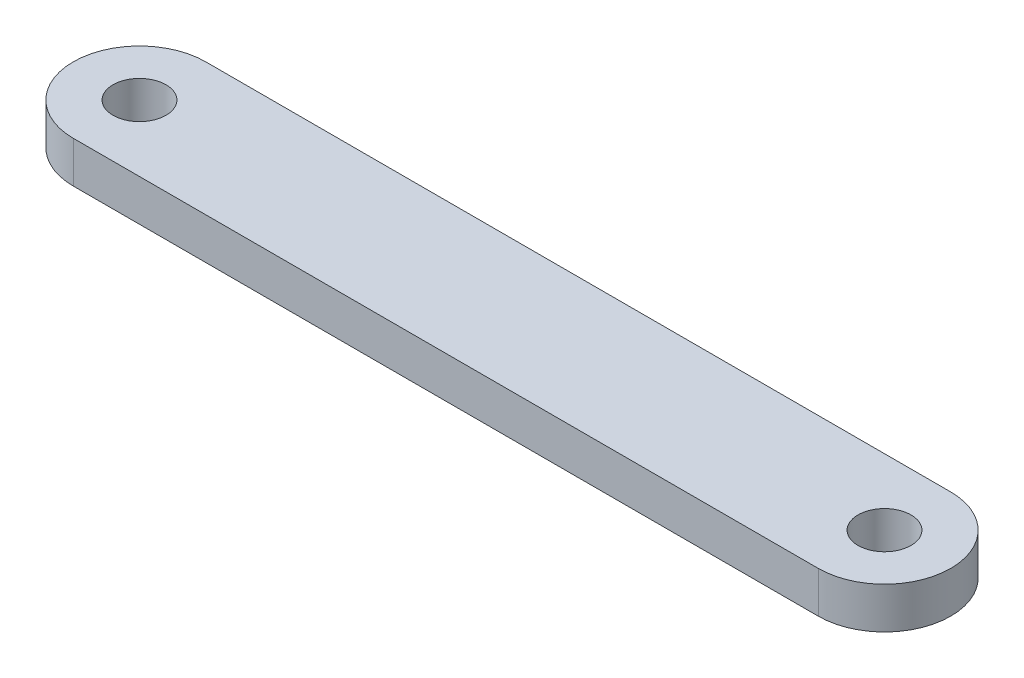
ISO-10303-21;
HEADER;
FILE_DESCRIPTION(('STEP AP214'),'2;1');
FILE_NAME('part.step','',(''),(''),'','','');
FILE_SCHEMA(('AUTOMOTIVE_DESIGN { 1 0 10303 214 1 1 1 1 }'));
ENDSEC;
DATA;
#1=APPLICATION_CONTEXT('core data for automotive mechanical design processes');
#2=APPLICATION_PROTOCOL_DEFINITION('international standard','automotive_design',2000,#1);
#3=PRODUCT_CONTEXT('',#1,'mechanical');
#4=PRODUCT('Part','Part','',(#3));
#5=PRODUCT_RELATED_PRODUCT_CATEGORY('part','',(#4));
#6=PRODUCT_DEFINITION_FORMATION('','',#4);
#7=PRODUCT_DEFINITION_CONTEXT('part definition',#1,'design');
#8=PRODUCT_DEFINITION('design','',#6,#7);
#9=PRODUCT_DEFINITION_SHAPE('','',#8);
#10=(LENGTH_UNIT() NAMED_UNIT(*) SI_UNIT(.MILLI.,.METRE.));
#11=(NAMED_UNIT(*) PLANE_ANGLE_UNIT() SI_UNIT($,.RADIAN.));
#12=(NAMED_UNIT(*) SI_UNIT($,.STERADIAN.) SOLID_ANGLE_UNIT());
#13=UNCERTAINTY_MEASURE_WITH_UNIT(LENGTH_MEASURE(1.E-05),#10,'distance_accuracy_value','');
#14=(GEOMETRIC_REPRESENTATION_CONTEXT(3) GLOBAL_UNCERTAINTY_ASSIGNED_CONTEXT((#13)) GLOBAL_UNIT_ASSIGNED_CONTEXT((#10,
#11,#12)) REPRESENTATION_CONTEXT('',''));
#15=CARTESIAN_POINT('',(0.,0.,0.));
#16=DIRECTION('',(0.,0.,1.));
#17=DIRECTION('',(1.,0.,0.));
#18=AXIS2_PLACEMENT_3D('',#15,#16,#17);
#19=CARTESIAN_POINT('',(0.,3.175,0.));
#20=DIRECTION('',(0.,1.,0.));
#21=DIRECTION('',(0.,0.,1.));
#22=AXIS2_PLACEMENT_3D('',#19,#20,#21);
#23=PLANE('',#22);
#24=CARTESIAN_POINT('',(-57.15,3.175,0.));
#25=DIRECTION('',(0.,1.,0.));
#26=DIRECTION('',(0.,0.,1.));
#27=AXIS2_PLACEMENT_3D('',#24,#25,#26);
#28=CIRCLE('',#27,2.032);
#29=CARTESIAN_POINT('',(-57.15,3.175,2.032));
#30=VERTEX_POINT('',#29);
#31=EDGE_CURVE('E100',#30,#30,#28,.T.);
#32=ORIENTED_EDGE('',*,*,#31,.F.);
#33=EDGE_LOOP('',(#32));
#34=FACE_BOUND('',#33,.T.);
#35=CARTESIAN_POINT('',(0.,3.175,0.));
#36=DIRECTION('',(0.,1.,0.));
#37=DIRECTION('',(0.,0.,1.));
#38=AXIS2_PLACEMENT_3D('',#35,#36,#37);
#39=CIRCLE('',#38,5.08);
#40=CARTESIAN_POINT('',(0.,3.175,5.08));
#41=VERTEX_POINT('',#40);
#42=CARTESIAN_POINT('',(0.,3.175,-5.08));
#43=VERTEX_POINT('',#42);
#44=EDGE_CURVE('E85',#41,#43,#39,.T.);
#45=ORIENTED_EDGE('',*,*,#44,.T.);
#46=DIRECTION('',(-1.,0.,0.));
#47=VECTOR('',#46,1.);
#48=CARTESIAN_POINT('',(0.,3.175,-5.08));
#49=LINE('',#48,#47);
#50=CARTESIAN_POINT('',(-57.15,3.175,-5.08));
#51=VERTEX_POINT('',#50);
#52=EDGE_CURVE('E80',#43,#51,#49,.T.);
#53=ORIENTED_EDGE('',*,*,#52,.T.);
#54=CARTESIAN_POINT('',(-57.15,3.175,0.));
#55=DIRECTION('',(0.,1.,0.));
#56=DIRECTION('',(0.,0.,1.));
#57=AXIS2_PLACEMENT_3D('',#54,#55,#56);
#58=CIRCLE('',#57,5.08);
#59=CARTESIAN_POINT('',(-57.15,3.175,5.08000000000001));
#60=VERTEX_POINT('',#59);
#61=EDGE_CURVE('E83',#51,#60,#58,.T.);
#62=ORIENTED_EDGE('',*,*,#61,.T.);
#63=DIRECTION('',(1.,0.,0.));
#64=VECTOR('',#63,1.);
#65=CARTESIAN_POINT('',(0.,3.175,5.08));
#66=LINE('',#65,#64);
#67=EDGE_CURVE('E50',#60,#41,#66,.T.);
#68=ORIENTED_EDGE('',*,*,#67,.T.);
#69=EDGE_LOOP('',(#45,#53,#62,#68));
#70=FACE_BOUND('',#69,.T.);
#71=CARTESIAN_POINT('',(0.,3.175,0.));
#72=DIRECTION('',(0.,1.,0.));
#73=DIRECTION('',(0.,0.,1.));
#74=AXIS2_PLACEMENT_3D('',#71,#72,#73);
#75=CIRCLE('',#74,2.032);
#76=CARTESIAN_POINT('',(0.,3.175,2.032));
#77=VERTEX_POINT('',#76);
#78=EDGE_CURVE('E115',#77,#77,#75,.T.);
#79=ORIENTED_EDGE('',*,*,#78,.F.);
#80=EDGE_LOOP('',(#79));
#81=FACE_BOUND('',#80,.T.);
#82=ADVANCED_FACE('F33',(#34,#70,#81),#23,.T.);
#83=CARTESIAN_POINT('',(0.,0.,0.));
#84=DIRECTION('',(0.,1.,0.));
#85=DIRECTION('',(0.,0.,1.));
#86=AXIS2_PLACEMENT_3D('',#83,#84,#85);
#87=PLANE('',#86);
#88=CARTESIAN_POINT('',(0.,0.,0.));
#89=DIRECTION('',(0.,1.,0.));
#90=DIRECTION('',(0.,0.,1.));
#91=AXIS2_PLACEMENT_3D('',#88,#89,#90);
#92=CIRCLE('',#91,5.08);
#93=CARTESIAN_POINT('',(0.,0.,5.08));
#94=VERTEX_POINT('',#93);
#95=CARTESIAN_POINT('',(0.,0.,-5.08));
#96=VERTEX_POINT('',#95);
#97=EDGE_CURVE('E97',#94,#96,#92,.T.);
#98=ORIENTED_EDGE('',*,*,#97,.F.);
#99=DIRECTION('',(1.,0.,0.));
#100=VECTOR('',#99,1.);
#101=CARTESIAN_POINT('',(0.,0.,5.08));
#102=LINE('',#101,#100);
#103=CARTESIAN_POINT('',(-57.15,0.,5.08000000000001));
#104=VERTEX_POINT('',#103);
#105=EDGE_CURVE('E73',#104,#94,#102,.T.);
#106=ORIENTED_EDGE('',*,*,#105,.F.);
#107=CARTESIAN_POINT('',(-57.15,0.,0.));
#108=DIRECTION('',(0.,1.,0.));
#109=DIRECTION('',(0.,0.,1.));
#110=AXIS2_PLACEMENT_3D('',#107,#108,#109);
#111=CIRCLE('',#110,5.08);
#112=CARTESIAN_POINT('',(-57.15,0.,-5.08));
#113=VERTEX_POINT('',#112);
#114=EDGE_CURVE('E67',#113,#104,#111,.T.);
#115=ORIENTED_EDGE('',*,*,#114,.F.);
#116=DIRECTION('',(-1.,0.,0.));
#117=VECTOR('',#116,1.);
#118=CARTESIAN_POINT('',(0.,0.,-5.08));
#119=LINE('',#118,#117);
#120=EDGE_CURVE('E89',#96,#113,#119,.T.);
#121=ORIENTED_EDGE('',*,*,#120,.F.);
#122=EDGE_LOOP('',(#98,#106,#115,#121));
#123=FACE_BOUND('',#122,.T.);
#124=CARTESIAN_POINT('',(-57.15,0.,0.));
#125=DIRECTION('',(0.,1.,0.));
#126=DIRECTION('',(0.,0.,1.));
#127=AXIS2_PLACEMENT_3D('',#124,#125,#126);
#128=CIRCLE('',#127,2.032);
#129=CARTESIAN_POINT('',(-57.15,0.,2.032));
#130=VERTEX_POINT('',#129);
#131=EDGE_CURVE('E112',#130,#130,#128,.T.);
#132=ORIENTED_EDGE('',*,*,#131,.T.);
#133=EDGE_LOOP('',(#132));
#134=FACE_BOUND('',#133,.T.);
#135=CARTESIAN_POINT('',(0.,0.,0.));
#136=DIRECTION('',(0.,1.,0.));
#137=DIRECTION('',(0.,0.,1.));
#138=AXIS2_PLACEMENT_3D('',#135,#136,#137);
#139=CIRCLE('',#138,2.032);
#140=CARTESIAN_POINT('',(0.,0.,2.032));
#141=VERTEX_POINT('',#140);
#142=EDGE_CURVE('E118',#141,#141,#139,.T.);
#143=ORIENTED_EDGE('',*,*,#142,.T.);
#144=EDGE_LOOP('',(#143));
#145=FACE_BOUND('',#144,.T.);
#146=ADVANCED_FACE('F108',(#123,#134,#145),#87,.F.);
#147=CARTESIAN_POINT('',(0.,3.175,0.));
#148=DIRECTION('',(0.,-1.,0.));
#149=DIRECTION('',(0.,0.,-1.));
#150=AXIS2_PLACEMENT_3D('',#147,#148,#149);
#151=CYLINDRICAL_SURFACE('',#150,5.08);
#152=ORIENTED_EDGE('',*,*,#97,.T.);
#153=DIRECTION('',(0.,-1.,0.));
#154=VECTOR('',#153,1.);
#155=CARTESIAN_POINT('',(0.,3.175,-5.08));
#156=LINE('',#155,#154);
#157=EDGE_CURVE('E11',#43,#96,#156,.T.);
#158=ORIENTED_EDGE('',*,*,#157,.F.);
#159=ORIENTED_EDGE('',*,*,#44,.F.);
#160=DIRECTION('',(0.,-1.,0.));
#161=VECTOR('',#160,1.);
#162=CARTESIAN_POINT('',(0.,3.175,5.08));
#163=LINE('',#162,#161);
#164=EDGE_CURVE('E93',#41,#94,#163,.T.);
#165=ORIENTED_EDGE('',*,*,#164,.T.);
#166=EDGE_LOOP('',(#152,#158,#159,#165));
#167=FACE_BOUND('',#166,.T.);
#168=ADVANCED_FACE('F35',(#167),#151,.T.);
#169=CARTESIAN_POINT('',(0.,3.175,-5.08));
#170=DIRECTION('',(0.,0.,1.));
#171=DIRECTION('',(1.,0.,0.));
#172=AXIS2_PLACEMENT_3D('',#169,#170,#171);
#173=PLANE('',#172);
#174=ORIENTED_EDGE('',*,*,#120,.T.);
#175=DIRECTION('',(0.,-1.,0.));
#176=VECTOR('',#175,1.);
#177=CARTESIAN_POINT('',(-57.15,3.175,-5.08));
#178=LINE('',#177,#176);
#179=EDGE_CURVE('E42',#51,#113,#178,.T.);
#180=ORIENTED_EDGE('',*,*,#179,.F.);
#181=ORIENTED_EDGE('',*,*,#52,.F.);
#182=ORIENTED_EDGE('',*,*,#157,.T.);
#183=EDGE_LOOP('',(#174,#180,#181,#182));
#184=FACE_BOUND('',#183,.T.);
#185=ADVANCED_FACE('F88',(#184),#173,.F.);
#186=CARTESIAN_POINT('',(-57.15,3.175,0.));
#187=DIRECTION('',(0.,-1.,0.));
#188=DIRECTION('',(0.,0.,-1.));
#189=AXIS2_PLACEMENT_3D('',#186,#187,#188);
#190=CYLINDRICAL_SURFACE('',#189,5.08);
#191=ORIENTED_EDGE('',*,*,#114,.T.);
#192=DIRECTION('',(0.,-1.,0.));
#193=VECTOR('',#192,1.);
#194=CARTESIAN_POINT('',(-57.15,3.175,5.08000000000001));
#195=LINE('',#194,#193);
#196=EDGE_CURVE('E90',#60,#104,#195,.T.);
#197=ORIENTED_EDGE('',*,*,#196,.F.);
#198=ORIENTED_EDGE('',*,*,#61,.F.);
#199=ORIENTED_EDGE('',*,*,#179,.T.);
#200=EDGE_LOOP('',(#191,#197,#198,#199));
#201=FACE_BOUND('',#200,.T.);
#202=ADVANCED_FACE('F91',(#201),#190,.T.);
#203=CARTESIAN_POINT('',(0.,3.175,5.08));
#204=DIRECTION('',(0.,0.,-1.));
#205=DIRECTION('',(-1.,0.,0.));
#206=AXIS2_PLACEMENT_3D('',#203,#204,#205);
#207=PLANE('',#206);
#208=ORIENTED_EDGE('',*,*,#105,.T.);
#209=ORIENTED_EDGE('',*,*,#164,.F.);
#210=ORIENTED_EDGE('',*,*,#67,.F.);
#211=ORIENTED_EDGE('',*,*,#196,.T.);
#212=EDGE_LOOP('',(#208,#209,#210,#211));
#213=FACE_BOUND('',#212,.T.);
#214=ADVANCED_FACE('F105',(#213),#207,.F.);
#215=CARTESIAN_POINT('',(-57.15,3.175,0.));
#216=DIRECTION('',(0.,-1.,0.));
#217=DIRECTION('',(0.,0.,-1.));
#218=AXIS2_PLACEMENT_3D('',#215,#216,#217);
#219=CYLINDRICAL_SURFACE('',#218,2.032);
#220=ORIENTED_EDGE('',*,*,#31,.T.);
#221=EDGE_LOOP('',(#220));
#222=FACE_BOUND('',#221,.T.);
#223=ORIENTED_EDGE('',*,*,#131,.F.);
#224=EDGE_LOOP('',(#223));
#225=FACE_BOUND('',#224,.T.);
#226=ADVANCED_FACE('F135',(#222,#225),#219,.F.);
#227=CARTESIAN_POINT('',(0.,3.175,0.));
#228=DIRECTION('',(0.,-1.,0.));
#229=DIRECTION('',(0.,0.,-1.));
#230=AXIS2_PLACEMENT_3D('',#227,#228,#229);
#231=CYLINDRICAL_SURFACE('',#230,2.032);
#232=ORIENTED_EDGE('',*,*,#78,.T.);
#233=EDGE_LOOP('',(#232));
#234=FACE_BOUND('',#233,.T.);
#235=ORIENTED_EDGE('',*,*,#142,.F.);
#236=EDGE_LOOP('',(#235));
#237=FACE_BOUND('',#236,.T.);
#238=ADVANCED_FACE('F124',(#234,#237),#231,.F.);
#239=CLOSED_SHELL('',(#82,#146,#168,#185,#202,#214,#226,#238));
#240=MANIFOLD_SOLID_BREP('B2',#239);
#241=ADVANCED_BREP_SHAPE_REPRESENTATION('',(#18,#240),#14);
#242=SHAPE_DEFINITION_REPRESENTATION(#9,#241);
ENDSEC;
END-ISO-10303-21;
